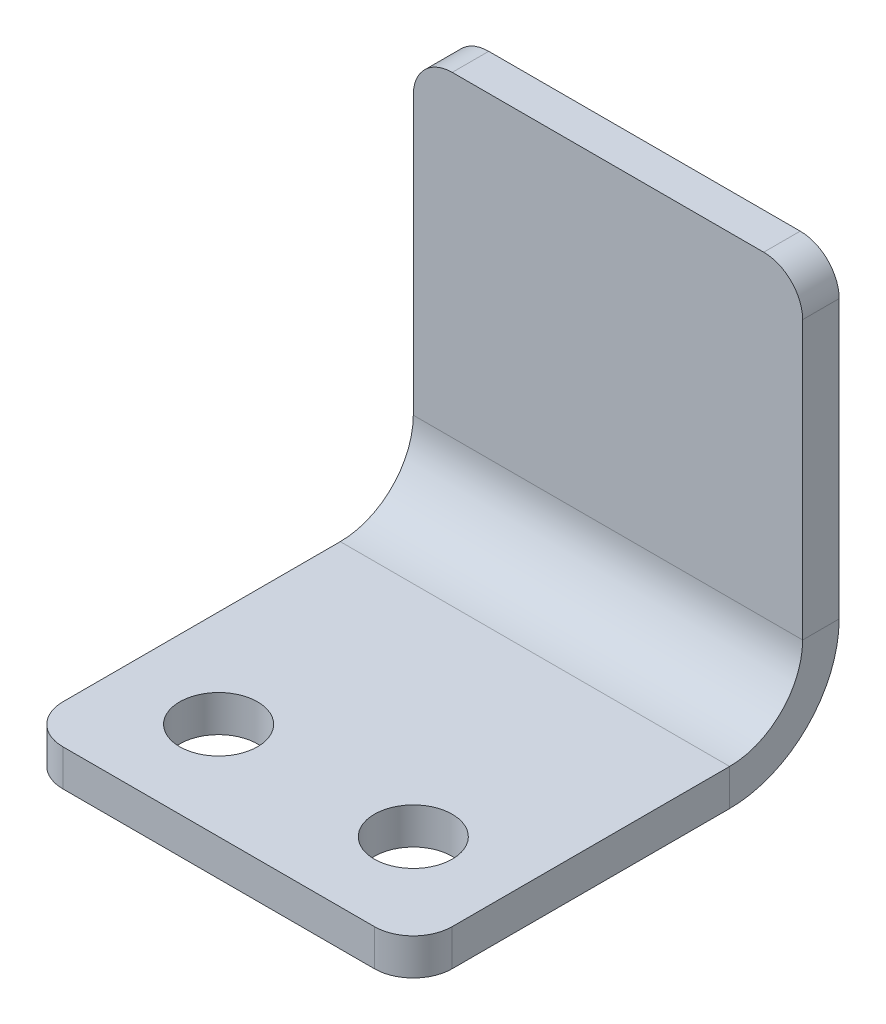
ISO-10303-21;
HEADER;
FILE_DESCRIPTION(('STEP AP214'),'2;1');
FILE_NAME('part.step','',(''),(''),'','','');
FILE_SCHEMA(('AUTOMOTIVE_DESIGN { 1 0 10303 214 1 1 1 1 }'));
ENDSEC;
DATA;
#1=APPLICATION_CONTEXT('core data for automotive mechanical design processes');
#2=APPLICATION_PROTOCOL_DEFINITION('international standard','automotive_design',2000,#1);
#3=PRODUCT_CONTEXT('',#1,'mechanical');
#4=PRODUCT('Part','Part','',(#3));
#5=PRODUCT_RELATED_PRODUCT_CATEGORY('part','',(#4));
#6=PRODUCT_DEFINITION_FORMATION('','',#4);
#7=PRODUCT_DEFINITION_CONTEXT('part definition',#1,'design');
#8=PRODUCT_DEFINITION('design','',#6,#7);
#9=PRODUCT_DEFINITION_SHAPE('','',#8);
#10=(LENGTH_UNIT() NAMED_UNIT(*) SI_UNIT(.MILLI.,.METRE.));
#11=(NAMED_UNIT(*) PLANE_ANGLE_UNIT() SI_UNIT($,.RADIAN.));
#12=(NAMED_UNIT(*) SI_UNIT($,.STERADIAN.) SOLID_ANGLE_UNIT());
#13=UNCERTAINTY_MEASURE_WITH_UNIT(LENGTH_MEASURE(1.E-05),#10,'distance_accuracy_value','');
#14=(GEOMETRIC_REPRESENTATION_CONTEXT(3) GLOBAL_UNCERTAINTY_ASSIGNED_CONTEXT((#13)) GLOBAL_UNIT_ASSIGNED_CONTEXT((#10,
#11,#12)) REPRESENTATION_CONTEXT('',''));
#15=CARTESIAN_POINT('',(0.,0.,0.));
#16=DIRECTION('',(0.,0.,1.));
#17=DIRECTION('',(1.,0.,0.));
#18=AXIS2_PLACEMENT_3D('',#15,#16,#17);
#19=CARTESIAN_POINT('',(12.7,27.78125,-11.509375));
#20=DIRECTION('',(1.,0.,0.));
#21=DIRECTION('',(0.,-1.,0.));
#22=AXIS2_PLACEMENT_3D('',#19,#20,#21);
#23=PLANE('',#22);
#24=DIRECTION('',(0.,1.,0.));
#25=VECTOR('',#24,1.);
#26=CARTESIAN_POINT('',(12.7,27.78125,-13.890625));
#27=LINE('',#26,#25);
#28=CARTESIAN_POINT('',(12.7,25.24125,-13.890625));
#29=VERTEX_POINT('',#28);
#30=CARTESIAN_POINT('',(12.7,7.14375,-13.890625));
#31=VERTEX_POINT('',#30);
#32=EDGE_CURVE('E245',#29,#31,#27,.F.);
#33=ORIENTED_EDGE('',*,*,#32,.F.);
#34=DIRECTION('',(0.,0.,1.));
#35=VECTOR('',#34,1.);
#36=CARTESIAN_POINT('',(12.7,25.24125,-11.509375));
#37=LINE('',#36,#35);
#38=CARTESIAN_POINT('',(12.7,25.24125,-11.509375));
#39=VERTEX_POINT('',#38);
#40=EDGE_CURVE('E11',#29,#39,#37,.T.);
#41=ORIENTED_EDGE('',*,*,#40,.T.);
#42=DIRECTION('',(0.,-1.,0.));
#43=VECTOR('',#42,1.);
#44=CARTESIAN_POINT('',(12.7,27.78125,-11.509375));
#45=LINE('',#44,#43);
#46=CARTESIAN_POINT('',(12.7,7.14375,-11.509375));
#47=VERTEX_POINT('',#46);
#48=EDGE_CURVE('E128',#39,#47,#45,.T.);
#49=ORIENTED_EDGE('',*,*,#48,.T.);
#50=DIRECTION('',(0.,0.,1.));
#51=VECTOR('',#50,1.);
#52=CARTESIAN_POINT('',(12.7,7.14375,-11.509375));
#53=LINE('',#52,#51);
#54=EDGE_CURVE('E130',#31,#47,#53,.T.);
#55=ORIENTED_EDGE('',*,*,#54,.F.);
#56=EDGE_LOOP('',(#33,#41,#49,#55));
#57=FACE_BOUND('',#56,.T.);
#58=ADVANCED_FACE('F37',(#57),#23,.T.);
#59=CARTESIAN_POINT('',(-12.7,27.78125,-11.509375));
#60=DIRECTION('',(0.,1.,0.));
#61=DIRECTION('',(1.,0.,0.));
#62=AXIS2_PLACEMENT_3D('',#59,#60,#61);
#63=PLANE('',#62);
#64=DIRECTION('',(-1.,0.,0.));
#65=VECTOR('',#64,1.);
#66=CARTESIAN_POINT('',(-12.7,27.78125,-13.890625));
#67=LINE('',#66,#65);
#68=CARTESIAN_POINT('',(-10.16,27.78125,-13.890625));
#69=VERTEX_POINT('',#68);
#70=CARTESIAN_POINT('',(10.16,27.78125,-13.890625));
#71=VERTEX_POINT('',#70);
#72=EDGE_CURVE('E242',#69,#71,#67,.F.);
#73=ORIENTED_EDGE('',*,*,#72,.F.);
#74=DIRECTION('',(0.,0.,-1.));
#75=VECTOR('',#74,1.);
#76=CARTESIAN_POINT('',(-10.16,27.78125,-11.509375));
#77=LINE('',#76,#75);
#78=CARTESIAN_POINT('',(-10.16,27.78125,-11.509375));
#79=VERTEX_POINT('',#78);
#80=EDGE_CURVE('E214',#69,#79,#77,.F.);
#81=ORIENTED_EDGE('',*,*,#80,.T.);
#82=DIRECTION('',(1.,0.,0.));
#83=VECTOR('',#82,1.);
#84=CARTESIAN_POINT('',(-12.7,27.78125,-11.509375));
#85=LINE('',#84,#83);
#86=CARTESIAN_POINT('',(10.16,27.78125,-11.509375));
#87=VERTEX_POINT('',#86);
#88=EDGE_CURVE('E135',#79,#87,#85,.T.);
#89=ORIENTED_EDGE('',*,*,#88,.T.);
#90=DIRECTION('',(0.,0.,1.));
#91=VECTOR('',#90,1.);
#92=CARTESIAN_POINT('',(10.16,27.78125,-11.509375));
#93=LINE('',#92,#91);
#94=EDGE_CURVE('E212',#87,#71,#93,.F.);
#95=ORIENTED_EDGE('',*,*,#94,.T.);
#96=EDGE_LOOP('',(#73,#81,#89,#95));
#97=FACE_BOUND('',#96,.T.);
#98=ADVANCED_FACE('F229',(#97),#63,.T.);
#99=CARTESIAN_POINT('',(-12.7,27.78125,-11.509375));
#100=DIRECTION('',(1.,0.,0.));
#101=DIRECTION('',(0.,-1.,0.));
#102=AXIS2_PLACEMENT_3D('',#99,#100,#101);
#103=PLANE('',#102);
#104=DIRECTION('',(0.,-1.,0.));
#105=VECTOR('',#104,1.);
#106=CARTESIAN_POINT('',(-12.7,27.78125,-11.509375));
#107=LINE('',#106,#105);
#108=CARTESIAN_POINT('',(-12.7,25.24125,-11.509375));
#109=VERTEX_POINT('',#108);
#110=CARTESIAN_POINT('',(-12.7,7.14375,-11.509375));
#111=VERTEX_POINT('',#110);
#112=EDGE_CURVE('E162',#109,#111,#107,.T.);
#113=ORIENTED_EDGE('',*,*,#112,.F.);
#114=DIRECTION('',(0.,0.,1.));
#115=VECTOR('',#114,1.);
#116=CARTESIAN_POINT('',(-12.7,25.24125,-11.509375));
#117=LINE('',#116,#115);
#118=CARTESIAN_POINT('',(-12.7,25.24125,-13.890625));
#119=VERTEX_POINT('',#118);
#120=EDGE_CURVE('E60',#109,#119,#117,.F.);
#121=ORIENTED_EDGE('',*,*,#120,.T.);
#122=DIRECTION('',(0.,1.,0.));
#123=VECTOR('',#122,1.);
#124=CARTESIAN_POINT('',(-12.7,27.78125,-13.890625));
#125=LINE('',#124,#123);
#126=CARTESIAN_POINT('',(-12.7,7.14375,-13.890625));
#127=VERTEX_POINT('',#126);
#128=EDGE_CURVE('E244',#119,#127,#125,.F.);
#129=ORIENTED_EDGE('',*,*,#128,.T.);
#130=DIRECTION('',(0.,0.,1.));
#131=VECTOR('',#130,1.);
#132=CARTESIAN_POINT('',(-12.7,7.14375,-11.509375));
#133=LINE('',#132,#131);
#134=EDGE_CURVE('E149',#127,#111,#133,.T.);
#135=ORIENTED_EDGE('',*,*,#134,.T.);
#136=EDGE_LOOP('',(#113,#121,#129,#135));
#137=FACE_BOUND('',#136,.T.);
#138=ADVANCED_FACE('F236',(#137),#103,.F.);
#139=CARTESIAN_POINT('',(-12.7,7.14375,-6.746875));
#140=DIRECTION('',(-1.,0.,0.));
#141=DIRECTION('',(0.,0.,1.));
#142=AXIS2_PLACEMENT_3D('',#139,#140,#141);
#143=PLANE('',#142);
#144=ORIENTED_EDGE('',*,*,#134,.F.);
#145=CARTESIAN_POINT('',(-12.7,7.14375,-6.746875));
#146=DIRECTION('',(-1.,0.,0.));
#147=DIRECTION('',(0.,0.,1.));
#148=AXIS2_PLACEMENT_3D('',#145,#146,#147);
#149=CIRCLE('',#148,7.14375);
#150=CARTESIAN_POINT('',(-12.7,0.,-6.746875));
#151=VERTEX_POINT('',#150);
#152=EDGE_CURVE('E249',#127,#151,#149,.T.);
#153=ORIENTED_EDGE('',*,*,#152,.T.);
#154=DIRECTION('',(0.,1.,0.));
#155=VECTOR('',#154,1.);
#156=CARTESIAN_POINT('',(-12.7,2.38125,-6.746875));
#157=LINE('',#156,#155);
#158=CARTESIAN_POINT('',(-12.7,2.38125,-6.746875));
#159=VERTEX_POINT('',#158);
#160=EDGE_CURVE('E255',#151,#159,#157,.T.);
#161=ORIENTED_EDGE('',*,*,#160,.T.);
#162=CARTESIAN_POINT('',(-12.7,7.14375,-6.746875));
#163=DIRECTION('',(1.,0.,0.));
#164=DIRECTION('',(0.,0.,-1.));
#165=AXIS2_PLACEMENT_3D('',#162,#163,#164);
#166=CIRCLE('',#165,4.7625);
#167=EDGE_CURVE('E136',#111,#159,#166,.F.);
#168=ORIENTED_EDGE('',*,*,#167,.F.);
#169=EDGE_LOOP('',(#144,#153,#161,#168));
#170=FACE_BOUND('',#169,.T.);
#171=ADVANCED_FACE('F289',(#170),#143,.T.);
#172=CARTESIAN_POINT('',(-12.7,2.38125,13.890625));
#173=DIRECTION('',(1.,0.,0.));
#174=DIRECTION('',(0.,0.,1.));
#175=AXIS2_PLACEMENT_3D('',#172,#173,#174);
#176=PLANE('',#175);
#177=DIRECTION('',(0.,0.,-1.));
#178=VECTOR('',#177,1.);
#179=CARTESIAN_POINT('',(-12.7,0.,0.));
#180=LINE('',#179,#178);
#181=CARTESIAN_POINT('',(-12.7,0.,11.350625));
#182=VERTEX_POINT('',#181);
#183=EDGE_CURVE('E247',#151,#182,#180,.F.);
#184=ORIENTED_EDGE('',*,*,#183,.T.);
#185=DIRECTION('',(0.,-1.,0.));
#186=VECTOR('',#185,1.);
#187=CARTESIAN_POINT('',(-12.7,2.38125,11.350625));
#188=LINE('',#187,#186);
#189=CARTESIAN_POINT('',(-12.7,2.38125,11.350625));
#190=VERTEX_POINT('',#189);
#191=EDGE_CURVE('E148',#182,#190,#188,.F.);
#192=ORIENTED_EDGE('',*,*,#191,.T.);
#193=DIRECTION('',(0.,0.,1.));
#194=VECTOR('',#193,1.);
#195=CARTESIAN_POINT('',(-12.7,2.38125,13.890625));
#196=LINE('',#195,#194);
#197=EDGE_CURVE('E174',#159,#190,#196,.T.);
#198=ORIENTED_EDGE('',*,*,#197,.F.);
#199=ORIENTED_EDGE('',*,*,#160,.F.);
#200=EDGE_LOOP('',(#184,#192,#198,#199));
#201=FACE_BOUND('',#200,.T.);
#202=ADVANCED_FACE('F264',(#201),#176,.F.);
#203=CARTESIAN_POINT('',(-12.7,2.38125,13.890625));
#204=DIRECTION('',(0.,0.,-1.));
#205=DIRECTION('',(1.,0.,0.));
#206=AXIS2_PLACEMENT_3D('',#203,#204,#205);
#207=PLANE('',#206);
#208=DIRECTION('',(1.,0.,0.));
#209=VECTOR('',#208,1.);
#210=CARTESIAN_POINT('',(-12.7,2.38125,13.890625));
#211=LINE('',#210,#209);
#212=CARTESIAN_POINT('',(-10.16,2.38125,13.890625));
#213=VERTEX_POINT('',#212);
#214=CARTESIAN_POINT('',(10.16,2.38125,13.890625));
#215=VERTEX_POINT('',#214);
#216=EDGE_CURVE('E168',#213,#215,#211,.T.);
#217=ORIENTED_EDGE('',*,*,#216,.F.);
#218=DIRECTION('',(0.,-1.,0.));
#219=VECTOR('',#218,1.);
#220=CARTESIAN_POINT('',(-10.16,2.38125,13.890625));
#221=LINE('',#220,#219);
#222=CARTESIAN_POINT('',(-10.16,0.,13.890625));
#223=VERTEX_POINT('',#222);
#224=EDGE_CURVE('E193',#213,#223,#221,.T.);
#225=ORIENTED_EDGE('',*,*,#224,.T.);
#226=DIRECTION('',(1.,0.,0.));
#227=VECTOR('',#226,1.);
#228=CARTESIAN_POINT('',(0.,0.,13.890625));
#229=LINE('',#228,#227);
#230=CARTESIAN_POINT('',(10.16,0.,13.890625));
#231=VERTEX_POINT('',#230);
#232=EDGE_CURVE('E283',#223,#231,#229,.T.);
#233=ORIENTED_EDGE('',*,*,#232,.T.);
#234=DIRECTION('',(0.,-1.,0.));
#235=VECTOR('',#234,1.);
#236=CARTESIAN_POINT('',(10.16,2.38125,13.890625));
#237=LINE('',#236,#235);
#238=EDGE_CURVE('E196',#231,#215,#237,.F.);
#239=ORIENTED_EDGE('',*,*,#238,.T.);
#240=EDGE_LOOP('',(#217,#225,#233,#239));
#241=FACE_BOUND('',#240,.T.);
#242=ADVANCED_FACE('F191',(#241),#207,.F.);
#243=CARTESIAN_POINT('',(12.7,2.38125,13.890625));
#244=DIRECTION('',(-1.,0.,0.));
#245=DIRECTION('',(0.,0.,-1.));
#246=AXIS2_PLACEMENT_3D('',#243,#244,#245);
#247=PLANE('',#246);
#248=DIRECTION('',(0.,0.,-1.));
#249=VECTOR('',#248,1.);
#250=CARTESIAN_POINT('',(12.7,2.38125,13.890625));
#251=LINE('',#250,#249);
#252=CARTESIAN_POINT('',(12.7,2.38125,11.350625));
#253=VERTEX_POINT('',#252);
#254=CARTESIAN_POINT('',(12.7,2.38125,-6.746875));
#255=VERTEX_POINT('',#254);
#256=EDGE_CURVE('E164',#253,#255,#251,.T.);
#257=ORIENTED_EDGE('',*,*,#256,.F.);
#258=DIRECTION('',(0.,-1.,0.));
#259=VECTOR('',#258,1.);
#260=CARTESIAN_POINT('',(12.7,2.38125,11.350625));
#261=LINE('',#260,#259);
#262=CARTESIAN_POINT('',(12.7,0.,11.350625));
#263=VERTEX_POINT('',#262);
#264=EDGE_CURVE('E210',#253,#263,#261,.T.);
#265=ORIENTED_EDGE('',*,*,#264,.T.);
#266=DIRECTION('',(0.,0.,-1.));
#267=VECTOR('',#266,1.);
#268=CARTESIAN_POINT('',(12.7,0.,0.));
#269=LINE('',#268,#267);
#270=CARTESIAN_POINT('',(12.7,0.,-6.746875));
#271=VERTEX_POINT('',#270);
#272=EDGE_CURVE('E270',#263,#271,#269,.T.);
#273=ORIENTED_EDGE('',*,*,#272,.T.);
#274=DIRECTION('',(0.,1.,0.));
#275=VECTOR('',#274,1.);
#276=CARTESIAN_POINT('',(12.7,2.38125,-6.746875));
#277=LINE('',#276,#275);
#278=EDGE_CURVE('E166',#271,#255,#277,.T.);
#279=ORIENTED_EDGE('',*,*,#278,.T.);
#280=EDGE_LOOP('',(#257,#265,#273,#279));
#281=FACE_BOUND('',#280,.T.);
#282=ADVANCED_FACE('F268',(#281),#247,.F.);
#283=CARTESIAN_POINT('',(12.7,7.14375,-6.746875));
#284=DIRECTION('',(-1.,0.,0.));
#285=DIRECTION('',(0.,0.,1.));
#286=AXIS2_PLACEMENT_3D('',#283,#284,#285);
#287=PLANE('',#286);
#288=CARTESIAN_POINT('',(12.7,7.14375,-6.746875));
#289=DIRECTION('',(-1.,0.,0.));
#290=DIRECTION('',(0.,0.,1.));
#291=AXIS2_PLACEMENT_3D('',#288,#289,#290);
#292=CIRCLE('',#291,7.14375);
#293=EDGE_CURVE('E147',#271,#31,#292,.F.);
#294=ORIENTED_EDGE('',*,*,#293,.T.);
#295=ORIENTED_EDGE('',*,*,#54,.T.);
#296=CARTESIAN_POINT('',(12.7,7.14375,-6.746875));
#297=DIRECTION('',(1.,0.,0.));
#298=DIRECTION('',(0.,0.,-1.));
#299=AXIS2_PLACEMENT_3D('',#296,#297,#298);
#300=CIRCLE('',#299,4.7625);
#301=EDGE_CURVE('E144',#255,#47,#300,.T.);
#302=ORIENTED_EDGE('',*,*,#301,.F.);
#303=ORIENTED_EDGE('',*,*,#278,.F.);
#304=EDGE_LOOP('',(#294,#295,#302,#303));
#305=FACE_BOUND('',#304,.T.);
#306=ADVANCED_FACE('F142',(#305),#287,.F.);
#307=CARTESIAN_POINT('',(0.,2.38125,0.));
#308=DIRECTION('',(0.,-1.,0.));
#309=DIRECTION('',(0.,0.,-1.));
#310=AXIS2_PLACEMENT_3D('',#307,#308,#309);
#311=PLANE('',#310);
#312=CARTESIAN_POINT('',(-6.35,2.38125,7.540625));
#313=DIRECTION('',(0.,1.,0.));
#314=DIRECTION('',(0.,0.,1.));
#315=AXIS2_PLACEMENT_3D('',#312,#313,#314);
#316=CIRCLE('',#315,2.54);
#317=CARTESIAN_POINT('',(-6.35,2.38125,10.080625));
#318=VERTEX_POINT('',#317);
#319=EDGE_CURVE('E515',#318,#318,#316,.T.);
#320=ORIENTED_EDGE('',*,*,#319,.F.);
#321=EDGE_LOOP('',(#320));
#322=FACE_BOUND('',#321,.T.);
#323=CARTESIAN_POINT('',(6.35,2.38125,7.540625));
#324=DIRECTION('',(0.,1.,0.));
#325=DIRECTION('',(0.,0.,1.));
#326=AXIS2_PLACEMENT_3D('',#323,#324,#325);
#327=CIRCLE('',#326,2.54);
#328=CARTESIAN_POINT('',(6.35,2.38125,10.080625));
#329=VERTEX_POINT('',#328);
#330=EDGE_CURVE('E223',#329,#329,#327,.T.);
#331=ORIENTED_EDGE('',*,*,#330,.F.);
#332=EDGE_LOOP('',(#331));
#333=FACE_BOUND('',#332,.T.);
#334=ORIENTED_EDGE('',*,*,#197,.T.);
#335=CARTESIAN_POINT('',(-10.16,2.38125,11.350625));
#336=DIRECTION('',(0.,-1.,0.));
#337=DIRECTION('',(0.,0.,-1.));
#338=AXIS2_PLACEMENT_3D('',#335,#336,#337);
#339=CIRCLE('',#338,2.54);
#340=EDGE_CURVE('E187',#190,#213,#339,.F.);
#341=ORIENTED_EDGE('',*,*,#340,.T.);
#342=ORIENTED_EDGE('',*,*,#216,.T.);
#343=CARTESIAN_POINT('',(10.16,2.38125,11.350625));
#344=DIRECTION('',(0.,-1.,0.));
#345=DIRECTION('',(0.,0.,-1.));
#346=AXIS2_PLACEMENT_3D('',#343,#344,#345);
#347=CIRCLE('',#346,2.54);
#348=EDGE_CURVE('E185',#215,#253,#347,.F.);
#349=ORIENTED_EDGE('',*,*,#348,.T.);
#350=ORIENTED_EDGE('',*,*,#256,.T.);
#351=DIRECTION('',(1.,0.,0.));
#352=VECTOR('',#351,1.);
#353=CARTESIAN_POINT('',(-12.7,2.38125,-6.746875));
#354=LINE('',#353,#352);
#355=EDGE_CURVE('E157',#255,#159,#354,.F.);
#356=ORIENTED_EDGE('',*,*,#355,.T.);
#357=EDGE_LOOP('',(#334,#341,#342,#349,#350,#356));
#358=FACE_BOUND('',#357,.T.);
#359=ADVANCED_FACE('F184',(#322,#333,#358),#311,.F.);
#360=CARTESIAN_POINT('',(-12.7,27.78125,-11.509375));
#361=DIRECTION('',(0.,0.,-1.));
#362=DIRECTION('',(-1.,0.,0.));
#363=AXIS2_PLACEMENT_3D('',#360,#361,#362);
#364=PLANE('',#363);
#365=ORIENTED_EDGE('',*,*,#88,.F.);
#366=CARTESIAN_POINT('',(-10.16,25.24125,-11.509375));
#367=DIRECTION('',(0.,0.,-1.));
#368=DIRECTION('',(-1.,0.,0.));
#369=AXIS2_PLACEMENT_3D('',#366,#367,#368);
#370=CIRCLE('',#369,2.54);
#371=EDGE_CURVE('E233',#79,#109,#370,.F.);
#372=ORIENTED_EDGE('',*,*,#371,.T.);
#373=ORIENTED_EDGE('',*,*,#112,.T.);
#374=DIRECTION('',(1.,0.,0.));
#375=VECTOR('',#374,1.);
#376=CARTESIAN_POINT('',(12.7,7.14375,-11.509375));
#377=LINE('',#376,#375);
#378=EDGE_CURVE('E155',#111,#47,#377,.T.);
#379=ORIENTED_EDGE('',*,*,#378,.T.);
#380=ORIENTED_EDGE('',*,*,#48,.F.);
#381=CARTESIAN_POINT('',(10.16,25.24125,-11.509375));
#382=DIRECTION('',(0.,0.,-1.));
#383=DIRECTION('',(-1.,0.,0.));
#384=AXIS2_PLACEMENT_3D('',#381,#382,#383);
#385=CIRCLE('',#384,2.54);
#386=EDGE_CURVE('E217',#39,#87,#385,.F.);
#387=ORIENTED_EDGE('',*,*,#386,.T.);
#388=EDGE_LOOP('',(#365,#372,#373,#379,#380,#387));
#389=FACE_BOUND('',#388,.T.);
#390=ADVANCED_FACE('F161',(#389),#364,.F.);
#391=CARTESIAN_POINT('',(-12.7,7.14375,-6.746875));
#392=DIRECTION('',(-1.,0.,0.));
#393=DIRECTION('',(0.,0.,1.));
#394=AXIS2_PLACEMENT_3D('',#391,#392,#393);
#395=CYLINDRICAL_SURFACE('',#394,4.7625);
#396=ORIENTED_EDGE('',*,*,#167,.T.);
#397=ORIENTED_EDGE('',*,*,#355,.F.);
#398=ORIENTED_EDGE('',*,*,#301,.T.);
#399=ORIENTED_EDGE('',*,*,#378,.F.);
#400=EDGE_LOOP('',(#396,#397,#398,#399));
#401=FACE_BOUND('',#400,.T.);
#402=ADVANCED_FACE('F154',(#401),#395,.F.);
#403=CARTESIAN_POINT('',(0.,0.,0.));
#404=DIRECTION('',(0.,-1.,0.));
#405=DIRECTION('',(0.,0.,-1.));
#406=AXIS2_PLACEMENT_3D('',#403,#404,#405);
#407=PLANE('',#406);
#408=CARTESIAN_POINT('',(-6.35,0.,7.540625));
#409=DIRECTION('',(0.,1.,0.));
#410=DIRECTION('',(0.,0.,1.));
#411=AXIS2_PLACEMENT_3D('',#408,#409,#410);
#412=CIRCLE('',#411,2.54);
#413=CARTESIAN_POINT('',(-6.35,0.,10.080625));
#414=VERTEX_POINT('',#413);
#415=EDGE_CURVE('E511',#414,#414,#412,.T.);
#416=ORIENTED_EDGE('',*,*,#415,.T.);
#417=EDGE_LOOP('',(#416));
#418=FACE_BOUND('',#417,.T.);
#419=CARTESIAN_POINT('',(6.35,0.,7.540625));
#420=DIRECTION('',(0.,1.,0.));
#421=DIRECTION('',(0.,0.,1.));
#422=AXIS2_PLACEMENT_3D('',#419,#420,#421);
#423=CIRCLE('',#422,2.54);
#424=CARTESIAN_POINT('',(6.35,0.,10.080625));
#425=VERTEX_POINT('',#424);
#426=EDGE_CURVE('E254',#425,#425,#423,.T.);
#427=ORIENTED_EDGE('',*,*,#426,.T.);
#428=EDGE_LOOP('',(#427));
#429=FACE_BOUND('',#428,.T.);
#430=ORIENTED_EDGE('',*,*,#232,.F.);
#431=CARTESIAN_POINT('',(-10.16,0.,11.350625));
#432=DIRECTION('',(0.,-1.,0.));
#433=DIRECTION('',(0.,0.,-1.));
#434=AXIS2_PLACEMENT_3D('',#431,#432,#433);
#435=CIRCLE('',#434,2.54);
#436=EDGE_CURVE('E202',#223,#182,#435,.T.);
#437=ORIENTED_EDGE('',*,*,#436,.T.);
#438=ORIENTED_EDGE('',*,*,#183,.F.);
#439=DIRECTION('',(1.,0.,0.));
#440=VECTOR('',#439,1.);
#441=CARTESIAN_POINT('',(0.,0.,-6.746875));
#442=LINE('',#441,#440);
#443=EDGE_CURVE('E158',#271,#151,#442,.F.);
#444=ORIENTED_EDGE('',*,*,#443,.F.);
#445=ORIENTED_EDGE('',*,*,#272,.F.);
#446=CARTESIAN_POINT('',(10.16,0.,11.350625));
#447=DIRECTION('',(0.,-1.,0.));
#448=DIRECTION('',(0.,0.,-1.));
#449=AXIS2_PLACEMENT_3D('',#446,#447,#448);
#450=CIRCLE('',#449,2.54);
#451=EDGE_CURVE('E203',#263,#231,#450,.T.);
#452=ORIENTED_EDGE('',*,*,#451,.T.);
#453=EDGE_LOOP('',(#430,#437,#438,#444,#445,#452));
#454=FACE_BOUND('',#453,.T.);
#455=ADVANCED_FACE('F274',(#418,#429,#454),#407,.T.);
#456=CARTESIAN_POINT('',(-12.7,27.78125,-13.890625));
#457=DIRECTION('',(0.,0.,-1.));
#458=DIRECTION('',(-1.,0.,0.));
#459=AXIS2_PLACEMENT_3D('',#456,#457,#458);
#460=PLANE('',#459);
#461=ORIENTED_EDGE('',*,*,#128,.F.);
#462=CARTESIAN_POINT('',(-10.16,25.24125,-13.890625));
#463=DIRECTION('',(0.,0.,-1.));
#464=DIRECTION('',(-1.,0.,0.));
#465=AXIS2_PLACEMENT_3D('',#462,#463,#464);
#466=CIRCLE('',#465,2.54);
#467=EDGE_CURVE('E45',#119,#69,#466,.T.);
#468=ORIENTED_EDGE('',*,*,#467,.T.);
#469=ORIENTED_EDGE('',*,*,#72,.T.);
#470=CARTESIAN_POINT('',(10.16,25.24125,-13.890625));
#471=DIRECTION('',(0.,0.,-1.));
#472=DIRECTION('',(-1.,0.,0.));
#473=AXIS2_PLACEMENT_3D('',#470,#471,#472);
#474=CIRCLE('',#473,2.54);
#475=EDGE_CURVE('E52',#71,#29,#474,.T.);
#476=ORIENTED_EDGE('',*,*,#475,.T.);
#477=ORIENTED_EDGE('',*,*,#32,.T.);
#478=DIRECTION('',(-1.,0.,0.));
#479=VECTOR('',#478,1.);
#480=CARTESIAN_POINT('',(-12.7,7.14375,-13.890625));
#481=LINE('',#480,#479);
#482=EDGE_CURVE('E279',#127,#31,#481,.F.);
#483=ORIENTED_EDGE('',*,*,#482,.F.);
#484=EDGE_LOOP('',(#461,#468,#469,#476,#477,#483));
#485=FACE_BOUND('',#484,.T.);
#486=ADVANCED_FACE('F241',(#485),#460,.T.);
#487=CARTESIAN_POINT('',(-12.7,7.14375,-6.746875));
#488=DIRECTION('',(-1.,0.,0.));
#489=DIRECTION('',(0.,0.,1.));
#490=AXIS2_PLACEMENT_3D('',#487,#488,#489);
#491=CYLINDRICAL_SURFACE('',#490,7.14375);
#492=ORIENTED_EDGE('',*,*,#152,.F.);
#493=ORIENTED_EDGE('',*,*,#482,.T.);
#494=ORIENTED_EDGE('',*,*,#293,.F.);
#495=ORIENTED_EDGE('',*,*,#443,.T.);
#496=EDGE_LOOP('',(#492,#493,#494,#495));
#497=FACE_BOUND('',#496,.T.);
#498=ADVANCED_FACE('F281',(#497),#491,.T.);
#499=CARTESIAN_POINT('',(-10.16,2.38125,11.350625));
#500=DIRECTION('',(0.,1.,0.));
#501=DIRECTION('',(0.,0.,1.));
#502=AXIS2_PLACEMENT_3D('',#499,#500,#501);
#503=CYLINDRICAL_SURFACE('',#502,2.54);
#504=ORIENTED_EDGE('',*,*,#436,.F.);
#505=ORIENTED_EDGE('',*,*,#224,.F.);
#506=ORIENTED_EDGE('',*,*,#340,.F.);
#507=ORIENTED_EDGE('',*,*,#191,.F.);
#508=EDGE_LOOP('',(#504,#505,#506,#507));
#509=FACE_BOUND('',#508,.T.);
#510=ADVANCED_FACE('F199',(#509),#503,.T.);
#511=CARTESIAN_POINT('',(10.16,2.38125,11.350625));
#512=DIRECTION('',(0.,1.,0.));
#513=DIRECTION('',(0.,0.,1.));
#514=AXIS2_PLACEMENT_3D('',#511,#512,#513);
#515=CYLINDRICAL_SURFACE('',#514,2.54);
#516=ORIENTED_EDGE('',*,*,#451,.F.);
#517=ORIENTED_EDGE('',*,*,#264,.F.);
#518=ORIENTED_EDGE('',*,*,#348,.F.);
#519=ORIENTED_EDGE('',*,*,#238,.F.);
#520=EDGE_LOOP('',(#516,#517,#518,#519));
#521=FACE_BOUND('',#520,.T.);
#522=ADVANCED_FACE('F309',(#521),#515,.T.);
#523=CARTESIAN_POINT('',(-10.16,25.24125,-11.509375));
#524=DIRECTION('',(0.,0.,-1.));
#525=DIRECTION('',(-1.,0.,0.));
#526=AXIS2_PLACEMENT_3D('',#523,#524,#525);
#527=CYLINDRICAL_SURFACE('',#526,2.54);
#528=ORIENTED_EDGE('',*,*,#467,.F.);
#529=ORIENTED_EDGE('',*,*,#120,.F.);
#530=ORIENTED_EDGE('',*,*,#371,.F.);
#531=ORIENTED_EDGE('',*,*,#80,.F.);
#532=EDGE_LOOP('',(#528,#529,#530,#531));
#533=FACE_BOUND('',#532,.T.);
#534=ADVANCED_FACE('F240',(#533),#527,.T.);
#535=CARTESIAN_POINT('',(10.16,25.24125,-11.509375));
#536=DIRECTION('',(0.,0.,1.));
#537=DIRECTION('',(1.,0.,0.));
#538=AXIS2_PLACEMENT_3D('',#535,#536,#537);
#539=CYLINDRICAL_SURFACE('',#538,2.54);
#540=ORIENTED_EDGE('',*,*,#475,.F.);
#541=ORIENTED_EDGE('',*,*,#94,.F.);
#542=ORIENTED_EDGE('',*,*,#386,.F.);
#543=ORIENTED_EDGE('',*,*,#40,.F.);
#544=EDGE_LOOP('',(#540,#541,#542,#543));
#545=FACE_BOUND('',#544,.T.);
#546=ADVANCED_FACE('F39',(#545),#539,.T.);
#547=CARTESIAN_POINT('',(6.35,0.,7.540625));
#548=DIRECTION('',(0.,1.,0.));
#549=DIRECTION('',(0.,0.,1.));
#550=AXIS2_PLACEMENT_3D('',#547,#548,#549);
#551=CYLINDRICAL_SURFACE('',#550,2.54);
#552=CARTESIAN_POINT('',(6.35,0.,10.080625));
#553=CARTESIAN_POINT('',(6.35,0.0248046875,10.080625));
#554=CARTESIAN_POINT('',(6.35,0.049609375,10.080625));
#555=CARTESIAN_POINT('',(6.35,0.09921875,10.080625));
#556=CARTESIAN_POINT('',(6.35,0.1240234375,10.080625));
#557=CARTESIAN_POINT('',(6.35,0.1736328125,10.080625));
#558=CARTESIAN_POINT('',(6.35,0.1984375,10.080625));
#559=CARTESIAN_POINT('',(6.35,0.248046875,10.080625));
#560=CARTESIAN_POINT('',(6.35,0.2728515625,10.080625));
#561=CARTESIAN_POINT('',(6.35,0.3224609375,10.080625));
#562=CARTESIAN_POINT('',(6.35,0.347265625,10.080625));
#563=CARTESIAN_POINT('',(6.35,0.396875,10.080625));
#564=CARTESIAN_POINT('',(6.35,0.4216796875,10.080625));
#565=CARTESIAN_POINT('',(6.35,0.4712890625,10.080625));
#566=CARTESIAN_POINT('',(6.35,0.49609375,10.080625));
#567=CARTESIAN_POINT('',(6.35,0.545703125,10.080625));
#568=CARTESIAN_POINT('',(6.35,0.5705078125,10.080625));
#569=CARTESIAN_POINT('',(6.35,0.6201171875,10.080625));
#570=CARTESIAN_POINT('',(6.35,0.644921875,10.080625));
#571=CARTESIAN_POINT('',(6.35,0.69453125,10.080625));
#572=CARTESIAN_POINT('',(6.35,0.7193359375,10.080625));
#573=CARTESIAN_POINT('',(6.35,0.7689453125,10.080625));
#574=CARTESIAN_POINT('',(6.35,0.79375,10.080625));
#575=CARTESIAN_POINT('',(6.35,0.843359375,10.080625));
#576=CARTESIAN_POINT('',(6.35,0.8681640625,10.080625));
#577=CARTESIAN_POINT('',(6.35,0.9177734375,10.080625));
#578=CARTESIAN_POINT('',(6.35,0.942578125,10.080625));
#579=CARTESIAN_POINT('',(6.35,0.9921875,10.080625));
#580=CARTESIAN_POINT('',(6.35,1.0169921875,10.080625));
#581=CARTESIAN_POINT('',(6.35,1.0666015625,10.080625));
#582=CARTESIAN_POINT('',(6.35,1.09140625,10.080625));
#583=CARTESIAN_POINT('',(6.35,1.141015625,10.080625));
#584=CARTESIAN_POINT('',(6.35,1.1658203125,10.080625));
#585=CARTESIAN_POINT('',(6.35,1.2154296875,10.080625));
#586=CARTESIAN_POINT('',(6.35,1.240234375,10.080625));
#587=CARTESIAN_POINT('',(6.35,1.28984375,10.080625));
#588=CARTESIAN_POINT('',(6.35,1.3146484375,10.080625));
#589=CARTESIAN_POINT('',(6.35,1.3642578125,10.080625));
#590=CARTESIAN_POINT('',(6.35,1.3890625,10.080625));
#591=CARTESIAN_POINT('',(6.35,1.438671875,10.080625));
#592=CARTESIAN_POINT('',(6.35,1.4634765625,10.080625));
#593=CARTESIAN_POINT('',(6.35,1.5130859375,10.080625));
#594=CARTESIAN_POINT('',(6.35,1.537890625,10.080625));
#595=CARTESIAN_POINT('',(6.35,1.5875,10.080625));
#596=CARTESIAN_POINT('',(6.35,1.6123046875,10.080625));
#597=CARTESIAN_POINT('',(6.35,1.6619140625,10.080625));
#598=CARTESIAN_POINT('',(6.35,1.68671875,10.080625));
#599=CARTESIAN_POINT('',(6.35,1.736328125,10.080625));
#600=CARTESIAN_POINT('',(6.35,1.7611328125,10.080625));
#601=CARTESIAN_POINT('',(6.35,1.8107421875,10.080625));
#602=CARTESIAN_POINT('',(6.35,1.835546875,10.080625));
#603=CARTESIAN_POINT('',(6.35,1.88515625,10.080625));
#604=CARTESIAN_POINT('',(6.35,1.9099609375,10.080625));
#605=CARTESIAN_POINT('',(6.35,1.9595703125,10.080625));
#606=CARTESIAN_POINT('',(6.35,1.984375,10.080625));
#607=CARTESIAN_POINT('',(6.35,2.033984375,10.080625));
#608=CARTESIAN_POINT('',(6.35,2.0587890625,10.080625));
#609=CARTESIAN_POINT('',(6.35,2.1083984375,10.080625));
#610=CARTESIAN_POINT('',(6.35,2.133203125,10.080625));
#611=CARTESIAN_POINT('',(6.35,2.1828125,10.080625));
#612=CARTESIAN_POINT('',(6.35,2.2076171875,10.080625));
#613=CARTESIAN_POINT('',(6.35,2.2572265625,10.080625));
#614=CARTESIAN_POINT('',(6.35,2.28203125,10.080625));
#615=CARTESIAN_POINT('',(6.35,2.331640625,10.080625));
#616=CARTESIAN_POINT('',(6.35,2.3564453125,10.080625));
#617=CARTESIAN_POINT('',(6.35,2.38125,10.080625));
#618=B_SPLINE_CURVE_WITH_KNOTS('',3,(#552,#553,#554,#555,#556,#557,#558,#559,#560,#561,#562,
#563,#564,#565,#566,#567,#568,#569,#570,#571,#572,#573,#574,#575,#576,#577,#578,#579,#580,#581,
#582,#583,#584,#585,#586,#587,#588,#589,#590,#591,#592,#593,#594,#595,#596,#597,#598,#599,#600,
#601,#602,#603,#604,#605,#606,#607,#608,#609,#610,#611,#612,#613,#614,#615,#616,#617),
.UNSPECIFIED.,.F.,.F.,(4,2,2,2,2,2,2,2,2,2,2,2,2,2,2,2,2,2,2,2,2,2,2,2,2,2,2,2,2,2,2,2,4),(0.,
0.0744140625,0.148828125,0.2232421875,0.29765625,0.3720703125,0.446484375,0.5208984375,
0.5953125,0.6697265625,0.744140625,0.8185546875,0.89296875,0.9673828125,1.041796875,
1.1162109375,1.190625,1.2650390625,1.339453125,1.4138671875,1.48828125,1.5626953125,1.637109375,
1.7115234375,1.7859375,1.8603515625,1.934765625,2.0091796875,2.08359375,2.1580078125,
2.232421875,2.3068359375,2.38125),.UNSPECIFIED.);
#619=EDGE_CURVE('BSEAM316',#425,#329,#618,.T.);
#620=ORIENTED_EDGE('',*,*,#426,.F.);
#621=ORIENTED_EDGE('',*,*,#330,.T.);
#622=ORIENTED_EDGE('',*,*,#619,.T.);
#623=ORIENTED_EDGE('',*,*,#619,.F.);
#624=EDGE_LOOP('',(#620,#622,#621,#623));
#625=FACE_BOUND('',#624,.T.);
#626=ADVANCED_FACE('F316',(#625),#551,.F.);
#627=CARTESIAN_POINT('',(-6.35,0.,7.540625));
#628=DIRECTION('',(0.,1.,0.));
#629=DIRECTION('',(0.,0.,1.));
#630=AXIS2_PLACEMENT_3D('',#627,#628,#629);
#631=CYLINDRICAL_SURFACE('',#630,2.54);
#632=CARTESIAN_POINT('',(-6.35,0.,10.080625));
#633=CARTESIAN_POINT('',(-6.35,0.0248046875,10.080625));
#634=CARTESIAN_POINT('',(-6.35,0.049609375,10.080625));
#635=CARTESIAN_POINT('',(-6.35,0.09921875,10.080625));
#636=CARTESIAN_POINT('',(-6.35,0.1240234375,10.080625));
#637=CARTESIAN_POINT('',(-6.35,0.1736328125,10.080625));
#638=CARTESIAN_POINT('',(-6.35,0.1984375,10.080625));
#639=CARTESIAN_POINT('',(-6.35,0.248046875,10.080625));
#640=CARTESIAN_POINT('',(-6.35,0.2728515625,10.080625));
#641=CARTESIAN_POINT('',(-6.35,0.3224609375,10.080625));
#642=CARTESIAN_POINT('',(-6.35,0.347265625,10.080625));
#643=CARTESIAN_POINT('',(-6.35,0.396875,10.080625));
#644=CARTESIAN_POINT('',(-6.35,0.4216796875,10.080625));
#645=CARTESIAN_POINT('',(-6.35,0.4712890625,10.080625));
#646=CARTESIAN_POINT('',(-6.35,0.49609375,10.080625));
#647=CARTESIAN_POINT('',(-6.35,0.545703125,10.080625));
#648=CARTESIAN_POINT('',(-6.35,0.5705078125,10.080625));
#649=CARTESIAN_POINT('',(-6.35,0.6201171875,10.080625));
#650=CARTESIAN_POINT('',(-6.35,0.644921875,10.080625));
#651=CARTESIAN_POINT('',(-6.35,0.69453125,10.080625));
#652=CARTESIAN_POINT('',(-6.35,0.7193359375,10.080625));
#653=CARTESIAN_POINT('',(-6.35,0.7689453125,10.080625));
#654=CARTESIAN_POINT('',(-6.35,0.79375,10.080625));
#655=CARTESIAN_POINT('',(-6.35,0.843359375,10.080625));
#656=CARTESIAN_POINT('',(-6.35,0.8681640625,10.080625));
#657=CARTESIAN_POINT('',(-6.35,0.9177734375,10.080625));
#658=CARTESIAN_POINT('',(-6.35,0.942578125,10.080625));
#659=CARTESIAN_POINT('',(-6.35,0.9921875,10.080625));
#660=CARTESIAN_POINT('',(-6.35,1.0169921875,10.080625));
#661=CARTESIAN_POINT('',(-6.35,1.0666015625,10.080625));
#662=CARTESIAN_POINT('',(-6.35,1.09140625,10.080625));
#663=CARTESIAN_POINT('',(-6.35,1.141015625,10.080625));
#664=CARTESIAN_POINT('',(-6.35,1.1658203125,10.080625));
#665=CARTESIAN_POINT('',(-6.35,1.2154296875,10.080625));
#666=CARTESIAN_POINT('',(-6.35,1.240234375,10.080625));
#667=CARTESIAN_POINT('',(-6.35,1.28984375,10.080625));
#668=CARTESIAN_POINT('',(-6.35,1.3146484375,10.080625));
#669=CARTESIAN_POINT('',(-6.35,1.3642578125,10.080625));
#670=CARTESIAN_POINT('',(-6.35,1.3890625,10.080625));
#671=CARTESIAN_POINT('',(-6.35,1.438671875,10.080625));
#672=CARTESIAN_POINT('',(-6.35,1.4634765625,10.080625));
#673=CARTESIAN_POINT('',(-6.35,1.5130859375,10.080625));
#674=CARTESIAN_POINT('',(-6.35,1.537890625,10.080625));
#675=CARTESIAN_POINT('',(-6.35,1.5875,10.080625));
#676=CARTESIAN_POINT('',(-6.35,1.6123046875,10.080625));
#677=CARTESIAN_POINT('',(-6.35,1.6619140625,10.080625));
#678=CARTESIAN_POINT('',(-6.35,1.68671875,10.080625));
#679=CARTESIAN_POINT('',(-6.35,1.736328125,10.080625));
#680=CARTESIAN_POINT('',(-6.35,1.7611328125,10.080625));
#681=CARTESIAN_POINT('',(-6.35,1.8107421875,10.080625));
#682=CARTESIAN_POINT('',(-6.35,1.835546875,10.080625));
#683=CARTESIAN_POINT('',(-6.35,1.88515625,10.080625));
#684=CARTESIAN_POINT('',(-6.35,1.9099609375,10.080625));
#685=CARTESIAN_POINT('',(-6.35,1.9595703125,10.080625));
#686=CARTESIAN_POINT('',(-6.35,1.984375,10.080625));
#687=CARTESIAN_POINT('',(-6.35,2.033984375,10.080625));
#688=CARTESIAN_POINT('',(-6.35,2.0587890625,10.080625));
#689=CARTESIAN_POINT('',(-6.35,2.1083984375,10.080625));
#690=CARTESIAN_POINT('',(-6.35,2.133203125,10.080625));
#691=CARTESIAN_POINT('',(-6.35,2.1828125,10.080625));
#692=CARTESIAN_POINT('',(-6.35,2.2076171875,10.080625));
#693=CARTESIAN_POINT('',(-6.35,2.2572265625,10.080625));
#694=CARTESIAN_POINT('',(-6.35,2.28203125,10.080625));
#695=CARTESIAN_POINT('',(-6.35,2.331640625,10.080625));
#696=CARTESIAN_POINT('',(-6.35,2.3564453125,10.080625));
#697=CARTESIAN_POINT('',(-6.35,2.38125,10.080625));
#698=B_SPLINE_CURVE_WITH_KNOTS('',3,(#632,#633,#634,#635,#636,#637,#638,#639,#640,#641,#642,
#643,#644,#645,#646,#647,#648,#649,#650,#651,#652,#653,#654,#655,#656,#657,#658,#659,#660,#661,
#662,#663,#664,#665,#666,#667,#668,#669,#670,#671,#672,#673,#674,#675,#676,#677,#678,#679,#680,
#681,#682,#683,#684,#685,#686,#687,#688,#689,#690,#691,#692,#693,#694,#695,#696,#697),
.UNSPECIFIED.,.F.,.F.,(4,2,2,2,2,2,2,2,2,2,2,2,2,2,2,2,2,2,2,2,2,2,2,2,2,2,2,2,2,2,2,2,4),(0.,
0.0744140625,0.148828125,0.2232421875,0.29765625,0.3720703125,0.446484375,0.5208984375,
0.5953125,0.6697265625,0.744140625,0.8185546875,0.89296875,0.9673828125,1.041796875,
1.1162109375,1.190625,1.2650390625,1.339453125,1.4138671875,1.48828125,1.5626953125,1.637109375,
1.7115234375,1.7859375,1.8603515625,1.934765625,2.0091796875,2.08359375,2.1580078125,
2.232421875,2.3068359375,2.38125),.UNSPECIFIED.);
#699=EDGE_CURVE('BSEAM320',#414,#318,#698,.T.);
#700=ORIENTED_EDGE('',*,*,#415,.F.);
#701=ORIENTED_EDGE('',*,*,#319,.T.);
#702=ORIENTED_EDGE('',*,*,#699,.T.);
#703=ORIENTED_EDGE('',*,*,#699,.F.);
#704=EDGE_LOOP('',(#700,#702,#701,#703));
#705=FACE_BOUND('',#704,.T.);
#706=ADVANCED_FACE('F320',(#705),#631,.F.);
#707=CLOSED_SHELL('',(#58,#98,#138,#171,#202,#242,#282,#306,#359,#390,#402,#455,#486,#498,#510,
#522,#534,#546,#626,#706));
#708=MANIFOLD_SOLID_BREP('B2',#707);
#709=ADVANCED_BREP_SHAPE_REPRESENTATION('',(#18,#708),#14);
#710=SHAPE_DEFINITION_REPRESENTATION(#9,#709);
ENDSEC;
END-ISO-10303-21;
